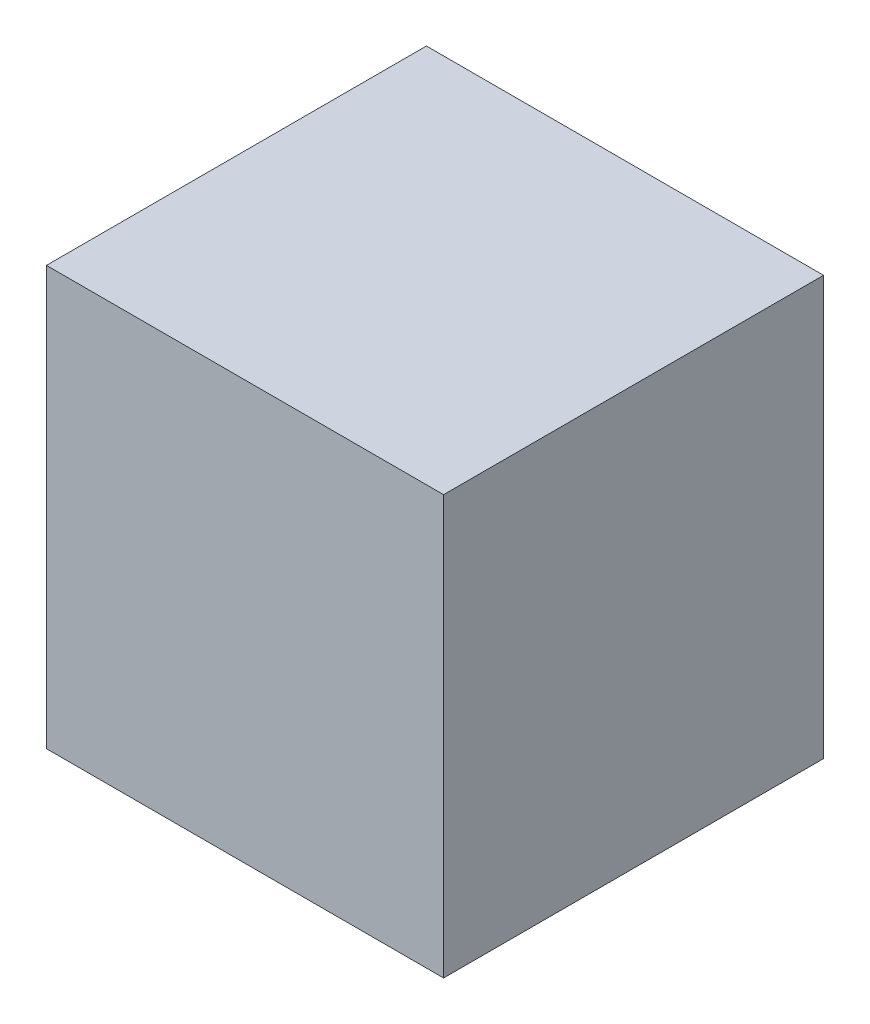
ISO-10303-21;
HEADER;
FILE_DESCRIPTION(('STEP AP214'),'2;1');
FILE_NAME('part.step','',(''),(''),'','','');
FILE_SCHEMA(('AUTOMOTIVE_DESIGN { 1 0 10303 214 1 1 1 1 }'));
ENDSEC;
DATA;
#1=APPLICATION_CONTEXT('core data for automotive mechanical design processes');
#2=APPLICATION_PROTOCOL_DEFINITION('international standard','automotive_design',2000,#1);
#3=PRODUCT_CONTEXT('',#1,'mechanical');
#4=PRODUCT('Part','Part','',(#3));
#5=PRODUCT_RELATED_PRODUCT_CATEGORY('part','',(#4));
#6=PRODUCT_DEFINITION_FORMATION('','',#4);
#7=PRODUCT_DEFINITION_CONTEXT('part definition',#1,'design');
#8=PRODUCT_DEFINITION('design','',#6,#7);
#9=PRODUCT_DEFINITION_SHAPE('','',#8);
#10=(LENGTH_UNIT() NAMED_UNIT(*) SI_UNIT(.MILLI.,.METRE.));
#11=(NAMED_UNIT(*) PLANE_ANGLE_UNIT() SI_UNIT($,.RADIAN.));
#12=(NAMED_UNIT(*) SI_UNIT($,.STERADIAN.) SOLID_ANGLE_UNIT());
#13=UNCERTAINTY_MEASURE_WITH_UNIT(LENGTH_MEASURE(1.E-05),#10,'distance_accuracy_value','');
#14=(GEOMETRIC_REPRESENTATION_CONTEXT(3) GLOBAL_UNCERTAINTY_ASSIGNED_CONTEXT((#13)) GLOBAL_UNIT_ASSIGNED_CONTEXT((#10,
#11,#12)) REPRESENTATION_CONTEXT('',''));
#15=CARTESIAN_POINT('',(0.,0.,0.));
#16=DIRECTION('',(0.,0.,1.));
#17=DIRECTION('',(1.,0.,0.));
#18=AXIS2_PLACEMENT_3D('',#15,#16,#17);
#19=CARTESIAN_POINT('',(234.95,495.3,224.79));
#20=DIRECTION('',(-1.,0.,0.));
#21=DIRECTION('',(0.,0.,1.));
#22=AXIS2_PLACEMENT_3D('',#19,#20,#21);
#23=PLANE('',#22);
#24=DIRECTION('',(0.,0.,-1.));
#25=VECTOR('',#24,1.);
#26=CARTESIAN_POINT('',(234.95,0.,224.79));
#27=LINE('',#26,#25);
#28=CARTESIAN_POINT('',(234.95,0.,224.79));
#29=VERTEX_POINT('',#28);
#30=CARTESIAN_POINT('',(234.95,0.,-224.79));
#31=VERTEX_POINT('',#30);
#32=EDGE_CURVE('E107',#29,#31,#27,.T.);
#33=ORIENTED_EDGE('',*,*,#32,.T.);
#34=DIRECTION('',(0.,-1.,0.));
#35=VECTOR('',#34,1.);
#36=CARTESIAN_POINT('',(234.95,495.3,-224.79));
#37=LINE('',#36,#35);
#38=CARTESIAN_POINT('',(234.95,495.3,-224.79));
#39=VERTEX_POINT('',#38);
#40=EDGE_CURVE('E11',#39,#31,#37,.T.);
#41=ORIENTED_EDGE('',*,*,#40,.F.);
#42=DIRECTION('',(0.,0.,-1.));
#43=VECTOR('',#42,1.);
#44=CARTESIAN_POINT('',(234.95,495.3,224.79));
#45=LINE('',#44,#43);
#46=CARTESIAN_POINT('',(234.95,495.3,224.79));
#47=VERTEX_POINT('',#46);
#48=EDGE_CURVE('E91',#47,#39,#45,.T.);
#49=ORIENTED_EDGE('',*,*,#48,.F.);
#50=DIRECTION('',(0.,-1.,0.));
#51=VECTOR('',#50,1.);
#52=CARTESIAN_POINT('',(234.95,495.3,224.79));
#53=LINE('',#52,#51);
#54=EDGE_CURVE('E103',#47,#29,#53,.T.);
#55=ORIENTED_EDGE('',*,*,#54,.T.);
#56=EDGE_LOOP('',(#33,#41,#49,#55));
#57=FACE_BOUND('',#56,.T.);
#58=ADVANCED_FACE('F39',(#57),#23,.F.);
#59=CARTESIAN_POINT('',(-234.95,495.3,-224.79));
#60=DIRECTION('',(0.,0.,1.));
#61=DIRECTION('',(1.,0.,0.));
#62=AXIS2_PLACEMENT_3D('',#59,#60,#61);
#63=PLANE('',#62);
#64=DIRECTION('',(-1.,0.,0.));
#65=VECTOR('',#64,1.);
#66=CARTESIAN_POINT('',(-234.95,0.,-224.79));
#67=LINE('',#66,#65);
#68=CARTESIAN_POINT('',(-234.95,0.,-224.79));
#69=VERTEX_POINT('',#68);
#70=EDGE_CURVE('E96',#31,#69,#67,.T.);
#71=ORIENTED_EDGE('',*,*,#70,.T.);
#72=DIRECTION('',(0.,-1.,0.));
#73=VECTOR('',#72,1.);
#74=CARTESIAN_POINT('',(-234.95,495.3,-224.79));
#75=LINE('',#74,#73);
#76=CARTESIAN_POINT('',(-234.95,495.3,-224.79));
#77=VERTEX_POINT('',#76);
#78=EDGE_CURVE('E48',#77,#69,#75,.T.);
#79=ORIENTED_EDGE('',*,*,#78,.F.);
#80=DIRECTION('',(-1.,0.,0.));
#81=VECTOR('',#80,1.);
#82=CARTESIAN_POINT('',(-234.95,495.3,-224.79));
#83=LINE('',#82,#81);
#84=EDGE_CURVE('E86',#39,#77,#83,.T.);
#85=ORIENTED_EDGE('',*,*,#84,.F.);
#86=ORIENTED_EDGE('',*,*,#40,.T.);
#87=EDGE_LOOP('',(#71,#79,#85,#86));
#88=FACE_BOUND('',#87,.T.);
#89=ADVANCED_FACE('F95',(#88),#63,.F.);
#90=CARTESIAN_POINT('',(-234.95,495.3,224.79));
#91=DIRECTION('',(1.,0.,0.));
#92=DIRECTION('',(0.,0.,-1.));
#93=AXIS2_PLACEMENT_3D('',#90,#91,#92);
#94=PLANE('',#93);
#95=DIRECTION('',(0.,0.,1.));
#96=VECTOR('',#95,1.);
#97=CARTESIAN_POINT('',(-234.95,0.,224.79));
#98=LINE('',#97,#96);
#99=CARTESIAN_POINT('',(-234.95,0.,224.79));
#100=VERTEX_POINT('',#99);
#101=EDGE_CURVE('E73',#69,#100,#98,.T.);
#102=ORIENTED_EDGE('',*,*,#101,.T.);
#103=DIRECTION('',(0.,-1.,0.));
#104=VECTOR('',#103,1.);
#105=CARTESIAN_POINT('',(-234.95,495.3,224.79));
#106=LINE('',#105,#104);
#107=CARTESIAN_POINT('',(-234.95,495.3,224.79));
#108=VERTEX_POINT('',#107);
#109=EDGE_CURVE('E98',#108,#100,#106,.T.);
#110=ORIENTED_EDGE('',*,*,#109,.F.);
#111=DIRECTION('',(0.,0.,1.));
#112=VECTOR('',#111,1.);
#113=CARTESIAN_POINT('',(-234.95,495.3,224.79));
#114=LINE('',#113,#112);
#115=EDGE_CURVE('E89',#77,#108,#114,.T.);
#116=ORIENTED_EDGE('',*,*,#115,.F.);
#117=ORIENTED_EDGE('',*,*,#78,.T.);
#118=EDGE_LOOP('',(#102,#110,#116,#117));
#119=FACE_BOUND('',#118,.T.);
#120=ADVANCED_FACE('F99',(#119),#94,.F.);
#121=CARTESIAN_POINT('',(-234.95,495.3,224.79));
#122=DIRECTION('',(0.,0.,-1.));
#123=DIRECTION('',(-1.,0.,0.));
#124=AXIS2_PLACEMENT_3D('',#121,#122,#123);
#125=PLANE('',#124);
#126=DIRECTION('',(1.,0.,0.));
#127=VECTOR('',#126,1.);
#128=CARTESIAN_POINT('',(-234.95,0.,224.79));
#129=LINE('',#128,#127);
#130=EDGE_CURVE('E79',#100,#29,#129,.T.);
#131=ORIENTED_EDGE('',*,*,#130,.T.);
#132=ORIENTED_EDGE('',*,*,#54,.F.);
#133=DIRECTION('',(1.,0.,0.));
#134=VECTOR('',#133,1.);
#135=CARTESIAN_POINT('',(-234.95,495.3,224.79));
#136=LINE('',#135,#134);
#137=EDGE_CURVE('E56',#108,#47,#136,.T.);
#138=ORIENTED_EDGE('',*,*,#137,.F.);
#139=ORIENTED_EDGE('',*,*,#109,.T.);
#140=EDGE_LOOP('',(#131,#132,#138,#139));
#141=FACE_BOUND('',#140,.T.);
#142=ADVANCED_FACE('F120',(#141),#125,.F.);
#143=CARTESIAN_POINT('',(0.,495.3,0.));
#144=DIRECTION('',(0.,-1.,0.));
#145=DIRECTION('',(0.,0.,-1.));
#146=AXIS2_PLACEMENT_3D('',#143,#144,#145);
#147=PLANE('',#146);
#148=ORIENTED_EDGE('',*,*,#48,.T.);
#149=ORIENTED_EDGE('',*,*,#84,.T.);
#150=ORIENTED_EDGE('',*,*,#115,.T.);
#151=ORIENTED_EDGE('',*,*,#137,.T.);
#152=EDGE_LOOP('',(#148,#149,#150,#151));
#153=FACE_BOUND('',#152,.T.);
#154=ADVANCED_FACE('F87',(#153),#147,.F.);
#155=CARTESIAN_POINT('',(0.,0.,0.));
#156=DIRECTION('',(0.,-1.,0.));
#157=DIRECTION('',(0.,0.,-1.));
#158=AXIS2_PLACEMENT_3D('',#155,#156,#157);
#159=PLANE('',#158);
#160=ORIENTED_EDGE('',*,*,#32,.F.);
#161=ORIENTED_EDGE('',*,*,#130,.F.);
#162=ORIENTED_EDGE('',*,*,#101,.F.);
#163=ORIENTED_EDGE('',*,*,#70,.F.);
#164=EDGE_LOOP('',(#160,#161,#162,#163));
#165=FACE_BOUND('',#164,.T.);
#166=ADVANCED_FACE('F123',(#165),#159,.T.);
#167=CLOSED_SHELL('',(#58,#89,#120,#142,#154,#166));
#168=MANIFOLD_SOLID_BREP('B2',#167);
#169=ADVANCED_BREP_SHAPE_REPRESENTATION('',(#18,#168),#14);
#170=SHAPE_DEFINITION_REPRESENTATION(#9,#169);
ENDSEC;
END-ISO-10303-21;
